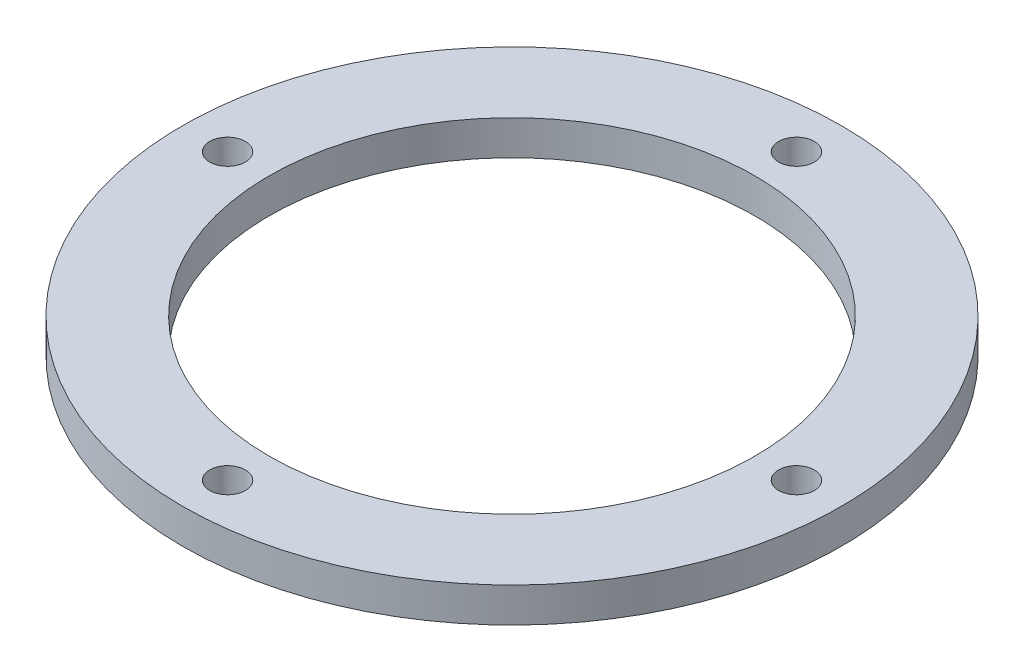
ISO-10303-21;
HEADER;
FILE_DESCRIPTION(('STEP AP214'),'2;1');
FILE_NAME('part.step','',(''),(''),'','','');
FILE_SCHEMA(('AUTOMOTIVE_DESIGN { 1 0 10303 214 1 1 1 1 }'));
ENDSEC;
DATA;
#1=APPLICATION_CONTEXT('core data for automotive mechanical design processes');
#2=APPLICATION_PROTOCOL_DEFINITION('international standard','automotive_design',2000,#1);
#3=PRODUCT_CONTEXT('',#1,'mechanical');
#4=PRODUCT('Part','Part','',(#3));
#5=PRODUCT_RELATED_PRODUCT_CATEGORY('part','',(#4));
#6=PRODUCT_DEFINITION_FORMATION('','',#4);
#7=PRODUCT_DEFINITION_CONTEXT('part definition',#1,'design');
#8=PRODUCT_DEFINITION('design','',#6,#7);
#9=PRODUCT_DEFINITION_SHAPE('','',#8);
#10=(LENGTH_UNIT() NAMED_UNIT(*) SI_UNIT(.MILLI.,.METRE.));
#11=(NAMED_UNIT(*) PLANE_ANGLE_UNIT() SI_UNIT($,.RADIAN.));
#12=(NAMED_UNIT(*) SI_UNIT($,.STERADIAN.) SOLID_ANGLE_UNIT());
#13=UNCERTAINTY_MEASURE_WITH_UNIT(LENGTH_MEASURE(1.E-05),#10,'distance_accuracy_value','');
#14=(GEOMETRIC_REPRESENTATION_CONTEXT(3) GLOBAL_UNCERTAINTY_ASSIGNED_CONTEXT((#13)) GLOBAL_UNIT_ASSIGNED_CONTEXT((#10,
#11,#12)) REPRESENTATION_CONTEXT('',''));
#15=CARTESIAN_POINT('',(0.,0.,0.));
#16=DIRECTION('',(0.,0.,1.));
#17=DIRECTION('',(1.,0.,0.));
#18=AXIS2_PLACEMENT_3D('',#15,#16,#17);
#19=CARTESIAN_POINT('',(0.,5.,0.));
#20=DIRECTION('',(0.,1.,0.));
#21=DIRECTION('',(0.,0.,1.));
#22=AXIS2_PLACEMENT_3D('',#19,#20,#21);
#23=PLANE('',#22);
#24=CARTESIAN_POINT('',(0.,5.,-41.));
#25=DIRECTION('',(0.,1.,0.));
#26=DIRECTION('',(0.,0.,1.));
#27=AXIS2_PLACEMENT_3D('',#24,#25,#26);
#28=CIRCLE('',#27,2.575);
#29=CARTESIAN_POINT('',(0.,5.,-38.425));
#30=VERTEX_POINT('',#29);
#31=EDGE_CURVE('E74',#30,#30,#28,.T.);
#32=ORIENTED_EDGE('',*,*,#31,.F.);
#33=EDGE_LOOP('',(#32));
#34=FACE_BOUND('',#33,.T.);
#35=CARTESIAN_POINT('',(41.,5.,0.));
#36=DIRECTION('',(0.,1.,0.));
#37=DIRECTION('',(0.,0.,1.));
#38=AXIS2_PLACEMENT_3D('',#35,#36,#37);
#39=CIRCLE('',#38,2.57500000000014);
#40=CARTESIAN_POINT('',(41.,5.,2.57500000000014));
#41=VERTEX_POINT('',#40);
#42=EDGE_CURVE('E71',#41,#41,#39,.T.);
#43=ORIENTED_EDGE('',*,*,#42,.F.);
#44=EDGE_LOOP('',(#43));
#45=FACE_BOUND('',#44,.T.);
#46=CARTESIAN_POINT('',(-2.86104205247266E-13,5.,41.));
#47=DIRECTION('',(0.,1.,0.));
#48=DIRECTION('',(0.,0.,1.));
#49=AXIS2_PLACEMENT_3D('',#46,#47,#48);
#50=CIRCLE('',#49,2.575);
#51=CARTESIAN_POINT('',(-2.86104205247266E-13,5.,43.575));
#52=VERTEX_POINT('',#51);
#53=EDGE_CURVE('E65',#52,#52,#50,.T.);
#54=ORIENTED_EDGE('',*,*,#53,.F.);
#55=EDGE_LOOP('',(#54));
#56=FACE_BOUND('',#55,.T.);
#57=CARTESIAN_POINT('',(-41.,5.,-4.29254940139834E-13));
#58=DIRECTION('',(0.,1.,0.));
#59=DIRECTION('',(0.,0.,1.));
#60=AXIS2_PLACEMENT_3D('',#57,#58,#59);
#61=CIRCLE('',#60,2.575);
#62=CARTESIAN_POINT('',(-41.,5.,2.57499999999957));
#63=VERTEX_POINT('',#62);
#64=EDGE_CURVE('E58',#63,#63,#61,.T.);
#65=ORIENTED_EDGE('',*,*,#64,.F.);
#66=EDGE_LOOP('',(#65));
#67=FACE_BOUND('',#66,.T.);
#68=CARTESIAN_POINT('',(0.,5.,0.));
#69=DIRECTION('',(0.,1.,0.));
#70=DIRECTION('',(0.,0.,1.));
#71=AXIS2_PLACEMENT_3D('',#68,#69,#70);
#72=CIRCLE('',#71,47.5);
#73=CARTESIAN_POINT('',(0.,5.,47.5));
#74=VERTEX_POINT('',#73);
#75=EDGE_CURVE('E10',#74,#74,#72,.T.);
#76=ORIENTED_EDGE('',*,*,#75,.T.);
#77=EDGE_LOOP('',(#76));
#78=FACE_BOUND('',#77,.T.);
#79=CARTESIAN_POINT('',(0.,5.,0.));
#80=DIRECTION('',(0.,1.,0.));
#81=DIRECTION('',(0.,0.,1.));
#82=AXIS2_PLACEMENT_3D('',#79,#80,#81);
#83=CIRCLE('',#82,35.);
#84=CARTESIAN_POINT('',(0.,5.,35.));
#85=VERTEX_POINT('',#84);
#86=EDGE_CURVE('E50',#85,#85,#83,.T.);
#87=ORIENTED_EDGE('',*,*,#86,.F.);
#88=EDGE_LOOP('',(#87));
#89=FACE_BOUND('',#88,.T.);
#90=ADVANCED_FACE('F39',(#34,#45,#56,#67,#78,#89),#23,.T.);
#91=CARTESIAN_POINT('',(0.,0.,0.));
#92=DIRECTION('',(0.,1.,0.));
#93=DIRECTION('',(0.,0.,1.));
#94=AXIS2_PLACEMENT_3D('',#91,#92,#93);
#95=PLANE('',#94);
#96=CARTESIAN_POINT('',(0.,0.,-41.));
#97=DIRECTION('',(0.,1.,0.));
#98=DIRECTION('',(0.,0.,1.));
#99=AXIS2_PLACEMENT_3D('',#96,#97,#98);
#100=CIRCLE('',#99,2.575);
#101=CARTESIAN_POINT('',(0.,0.,-38.425));
#102=VERTEX_POINT('',#101);
#103=EDGE_CURVE('E55',#102,#102,#100,.F.);
#104=ORIENTED_EDGE('',*,*,#103,.F.);
#105=EDGE_LOOP('',(#104));
#106=FACE_BOUND('',#105,.T.);
#107=CARTESIAN_POINT('',(41.,0.,0.));
#108=DIRECTION('',(0.,1.,0.));
#109=DIRECTION('',(0.,0.,1.));
#110=AXIS2_PLACEMENT_3D('',#107,#108,#109);
#111=CIRCLE('',#110,2.57500000000014);
#112=CARTESIAN_POINT('',(41.,0.,2.57500000000014));
#113=VERTEX_POINT('',#112);
#114=EDGE_CURVE('E68',#113,#113,#111,.F.);
#115=ORIENTED_EDGE('',*,*,#114,.F.);
#116=EDGE_LOOP('',(#115));
#117=FACE_BOUND('',#116,.T.);
#118=CARTESIAN_POINT('',(-2.86104205247266E-13,0.,41.));
#119=DIRECTION('',(0.,1.,0.));
#120=DIRECTION('',(0.,0.,1.));
#121=AXIS2_PLACEMENT_3D('',#118,#119,#120);
#122=CIRCLE('',#121,2.575);
#123=CARTESIAN_POINT('',(-2.86104205247266E-13,0.,43.575));
#124=VERTEX_POINT('',#123);
#125=EDGE_CURVE('E61',#124,#124,#122,.F.);
#126=ORIENTED_EDGE('',*,*,#125,.F.);
#127=EDGE_LOOP('',(#126));
#128=FACE_BOUND('',#127,.T.);
#129=CARTESIAN_POINT('',(-41.,0.,-4.29254940139834E-13));
#130=DIRECTION('',(0.,1.,0.));
#131=DIRECTION('',(0.,0.,1.));
#132=AXIS2_PLACEMENT_3D('',#129,#130,#131);
#133=CIRCLE('',#132,2.575);
#134=CARTESIAN_POINT('',(-41.,0.,2.57499999999957));
#135=VERTEX_POINT('',#134);
#136=EDGE_CURVE('E62',#135,#135,#133,.F.);
#137=ORIENTED_EDGE('',*,*,#136,.F.);
#138=EDGE_LOOP('',(#137));
#139=FACE_BOUND('',#138,.T.);
#140=CARTESIAN_POINT('',(0.,0.,0.));
#141=DIRECTION('',(0.,1.,0.));
#142=DIRECTION('',(0.,0.,1.));
#143=AXIS2_PLACEMENT_3D('',#140,#141,#142);
#144=CIRCLE('',#143,47.5);
#145=CARTESIAN_POINT('',(0.,0.,47.5));
#146=VERTEX_POINT('',#145);
#147=EDGE_CURVE('E43',#146,#146,#144,.T.);
#148=ORIENTED_EDGE('',*,*,#147,.F.);
#149=EDGE_LOOP('',(#148));
#150=FACE_BOUND('',#149,.T.);
#151=CARTESIAN_POINT('',(0.,0.,0.));
#152=DIRECTION('',(0.,1.,0.));
#153=DIRECTION('',(0.,0.,1.));
#154=AXIS2_PLACEMENT_3D('',#151,#152,#153);
#155=CIRCLE('',#154,35.);
#156=CARTESIAN_POINT('',(0.,0.,35.));
#157=VERTEX_POINT('',#156);
#158=EDGE_CURVE('E52',#157,#157,#155,.T.);
#159=ORIENTED_EDGE('',*,*,#158,.T.);
#160=EDGE_LOOP('',(#159));
#161=FACE_BOUND('',#160,.T.);
#162=ADVANCED_FACE('F87',(#106,#117,#128,#139,#150,#161),#95,.F.);
#163=CARTESIAN_POINT('',(0.,5.,0.));
#164=DIRECTION('',(0.,-1.,0.));
#165=DIRECTION('',(0.,0.,-1.));
#166=AXIS2_PLACEMENT_3D('',#163,#164,#165);
#167=CYLINDRICAL_SURFACE('',#166,47.5);
#168=ORIENTED_EDGE('',*,*,#75,.F.);
#169=EDGE_LOOP('',(#168));
#170=FACE_BOUND('',#169,.T.);
#171=ORIENTED_EDGE('',*,*,#147,.T.);
#172=EDGE_LOOP('',(#171));
#173=FACE_BOUND('',#172,.T.);
#174=ADVANCED_FACE('F41',(#170,#173),#167,.T.);
#175=CARTESIAN_POINT('',(0.,5.,0.));
#176=DIRECTION('',(0.,-1.,0.));
#177=DIRECTION('',(0.,0.,-1.));
#178=AXIS2_PLACEMENT_3D('',#175,#176,#177);
#179=CYLINDRICAL_SURFACE('',#178,35.);
#180=ORIENTED_EDGE('',*,*,#86,.T.);
#181=EDGE_LOOP('',(#180));
#182=FACE_BOUND('',#181,.T.);
#183=ORIENTED_EDGE('',*,*,#158,.F.);
#184=EDGE_LOOP('',(#183));
#185=FACE_BOUND('',#184,.T.);
#186=ADVANCED_FACE('F97',(#182,#185),#179,.F.);
#187=CARTESIAN_POINT('',(-41.,-0.00100000000000013,-4.29254940139834E-13));
#188=DIRECTION('',(0.,1.,0.));
#189=DIRECTION('',(0.,0.,1.));
#190=AXIS2_PLACEMENT_3D('',#187,#188,#189);
#191=CYLINDRICAL_SURFACE('',#190,2.575);
#192=ORIENTED_EDGE('',*,*,#64,.T.);
#193=EDGE_LOOP('',(#192));
#194=FACE_BOUND('',#193,.T.);
#195=ORIENTED_EDGE('',*,*,#136,.T.);
#196=EDGE_LOOP('',(#195));
#197=FACE_BOUND('',#196,.T.);
#198=ADVANCED_FACE('F100',(#194,#197),#191,.F.);
#199=CARTESIAN_POINT('',(-2.86104205247266E-13,-0.00100000000000013,41.));
#200=DIRECTION('',(0.,1.,0.));
#201=DIRECTION('',(0.,0.,1.));
#202=AXIS2_PLACEMENT_3D('',#199,#200,#201);
#203=CYLINDRICAL_SURFACE('',#202,2.575);
#204=ORIENTED_EDGE('',*,*,#53,.T.);
#205=EDGE_LOOP('',(#204));
#206=FACE_BOUND('',#205,.T.);
#207=ORIENTED_EDGE('',*,*,#125,.T.);
#208=EDGE_LOOP('',(#207));
#209=FACE_BOUND('',#208,.T.);
#210=ADVANCED_FACE('F115',(#206,#209),#203,.F.);
#211=CARTESIAN_POINT('',(41.,-0.00100000000000013,0.));
#212=DIRECTION('',(0.,1.,0.));
#213=DIRECTION('',(0.,0.,1.));
#214=AXIS2_PLACEMENT_3D('',#211,#212,#213);
#215=CYLINDRICAL_SURFACE('',#214,2.57500000000014);
#216=ORIENTED_EDGE('',*,*,#42,.T.);
#217=EDGE_LOOP('',(#216));
#218=FACE_BOUND('',#217,.T.);
#219=ORIENTED_EDGE('',*,*,#114,.T.);
#220=EDGE_LOOP('',(#219));
#221=FACE_BOUND('',#220,.T.);
#222=ADVANCED_FACE('F119',(#218,#221),#215,.F.);
#223=CARTESIAN_POINT('',(0.,-0.00100000000000013,-41.));
#224=DIRECTION('',(0.,1.,0.));
#225=DIRECTION('',(0.,0.,1.));
#226=AXIS2_PLACEMENT_3D('',#223,#224,#225);
#227=CYLINDRICAL_SURFACE('',#226,2.575);
#228=ORIENTED_EDGE('',*,*,#31,.T.);
#229=EDGE_LOOP('',(#228));
#230=FACE_BOUND('',#229,.T.);
#231=ORIENTED_EDGE('',*,*,#103,.T.);
#232=EDGE_LOOP('',(#231));
#233=FACE_BOUND('',#232,.T.);
#234=ADVANCED_FACE('F82',(#230,#233),#227,.F.);
#235=CLOSED_SHELL('',(#90,#162,#174,#186,#198,#210,#222,#234));
#236=MANIFOLD_SOLID_BREP('B2',#235);
#237=ADVANCED_BREP_SHAPE_REPRESENTATION('',(#18,#236),#14);
#238=SHAPE_DEFINITION_REPRESENTATION(#9,#237);
ENDSEC;
END-ISO-10303-21;
